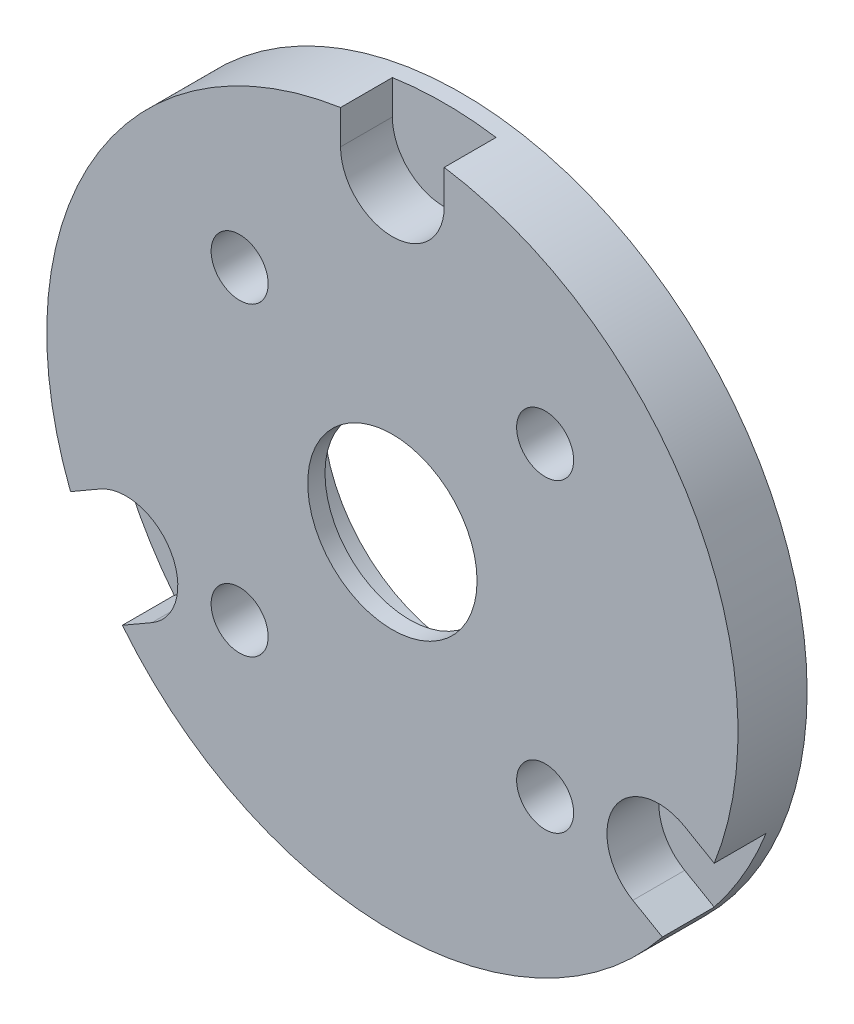
ISO-10303-21;
HEADER;
FILE_DESCRIPTION(('STEP AP214'),'2;1');
FILE_NAME('part.step','',(''),(''),'','','');
FILE_SCHEMA(('AUTOMOTIVE_DESIGN { 1 0 10303 214 1 1 1 1 }'));
ENDSEC;
DATA;
#1=APPLICATION_CONTEXT('core data for automotive mechanical design processes');
#2=APPLICATION_PROTOCOL_DEFINITION('international standard','automotive_design',2000,#1);
#3=PRODUCT_CONTEXT('',#1,'mechanical');
#4=PRODUCT('Part','Part','',(#3));
#5=PRODUCT_RELATED_PRODUCT_CATEGORY('part','',(#4));
#6=PRODUCT_DEFINITION_FORMATION('','',#4);
#7=PRODUCT_DEFINITION_CONTEXT('part definition',#1,'design');
#8=PRODUCT_DEFINITION('design','',#6,#7);
#9=PRODUCT_DEFINITION_SHAPE('','',#8);
#10=(LENGTH_UNIT() NAMED_UNIT(*) SI_UNIT(.MILLI.,.METRE.));
#11=(NAMED_UNIT(*) PLANE_ANGLE_UNIT() SI_UNIT($,.RADIAN.));
#12=(NAMED_UNIT(*) SI_UNIT($,.STERADIAN.) SOLID_ANGLE_UNIT());
#13=UNCERTAINTY_MEASURE_WITH_UNIT(LENGTH_MEASURE(1.E-05),#10,'distance_accuracy_value','');
#14=(GEOMETRIC_REPRESENTATION_CONTEXT(3) GLOBAL_UNCERTAINTY_ASSIGNED_CONTEXT((#13)) GLOBAL_UNIT_ASSIGNED_CONTEXT((#10,
#11,#12)) REPRESENTATION_CONTEXT('',''));
#15=CARTESIAN_POINT('',(0.,0.,0.));
#16=DIRECTION('',(0.,0.,1.));
#17=DIRECTION('',(1.,0.,0.));
#18=AXIS2_PLACEMENT_3D('',#15,#16,#17);
#19=CARTESIAN_POINT('',(0.,0.,0.));
#20=DIRECTION('',(0.,0.,1.));
#21=DIRECTION('',(1.,0.,0.));
#22=AXIS2_PLACEMENT_3D('',#19,#20,#21);
#23=CYLINDRICAL_SURFACE('',#22,4.9);
#24=CARTESIAN_POINT('',(0.,0.,4.));
#25=DIRECTION('',(0.,0.,1.));
#26=DIRECTION('',(1.,0.,0.));
#27=AXIS2_PLACEMENT_3D('',#24,#25,#26);
#28=CIRCLE('',#27,4.9);
#29=CARTESIAN_POINT('',(4.9,0.,4.));
#30=VERTEX_POINT('',#29);
#31=EDGE_CURVE('E453',#30,#30,#28,.T.);
#32=ORIENTED_EDGE('',*,*,#31,.T.);
#33=EDGE_LOOP('',(#32));
#34=FACE_BOUND('',#33,.T.);
#35=CARTESIAN_POINT('',(0.,0.,3.));
#36=DIRECTION('',(0.,0.,-1.));
#37=DIRECTION('',(-1.,0.,0.));
#38=AXIS2_PLACEMENT_3D('',#35,#36,#37);
#39=CIRCLE('',#38,4.9);
#40=CARTESIAN_POINT('',(-4.9,0.,3.));
#41=VERTEX_POINT('',#40);
#42=EDGE_CURVE('E38',#41,#41,#39,.F.);
#43=ORIENTED_EDGE('',*,*,#42,.F.);
#44=EDGE_LOOP('',(#43));
#45=FACE_BOUND('',#44,.T.);
#46=ADVANCED_FACE('F34',(#34,#45),#23,.F.);
#47=CARTESIAN_POINT('',(0.,0.,4.));
#48=DIRECTION('',(0.,0.,-1.));
#49=DIRECTION('',(-1.,0.,0.));
#50=AXIS2_PLACEMENT_3D('',#47,#48,#49);
#51=CYLINDRICAL_SURFACE('',#50,20.);
#52=CARTESIAN_POINT('',(0.,0.,4.));
#53=DIRECTION('',(0.,0.,1.));
#54=DIRECTION('',(1.,0.,0.));
#55=AXIS2_PLACEMENT_3D('',#52,#53,#54);
#56=CIRCLE('',#55,20.);
#57=CARTESIAN_POINT('',(-15.6245437895434,-12.4849361779962,4.));
#58=VERTEX_POINT('',#57);
#59=CARTESIAN_POINT('',(15.624543789544,-12.4849361779956,4.));
#60=VERTEX_POINT('',#59);
#61=EDGE_CURVE('E210',#58,#60,#56,.T.);
#62=ORIENTED_EDGE('',*,*,#61,.F.);
#63=DIRECTION('',(0.,0.,-1.));
#64=VECTOR('',#63,1.);
#65=CARTESIAN_POINT('',(-15.6245437895434,-12.4849361779962,4.));
#66=LINE('',#65,#64);
#67=CARTESIAN_POINT('',(-15.6245437895434,-12.4849361779962,1.));
#68=VERTEX_POINT('',#67);
#69=EDGE_CURVE('E155',#58,#68,#66,.T.);
#70=ORIENTED_EDGE('',*,*,#69,.T.);
#71=CARTESIAN_POINT('',(0.,0.,1.));
#72=DIRECTION('',(0.,0.,1.));
#73=DIRECTION('',(1.,0.,0.));
#74=AXIS2_PLACEMENT_3D('',#71,#72,#73);
#75=CIRCLE('',#74,20.);
#76=CARTESIAN_POINT('',(-18.6245437895436,-7.28878375528967,1.));
#77=VERTEX_POINT('',#76);
#78=EDGE_CURVE('E11',#77,#68,#75,.T.);
#79=ORIENTED_EDGE('',*,*,#78,.F.);
#80=DIRECTION('',(0.,0.,-1.));
#81=VECTOR('',#80,1.);
#82=CARTESIAN_POINT('',(-18.6245437895436,-7.28878375528967,4.));
#83=LINE('',#82,#81);
#84=CARTESIAN_POINT('',(-18.6245437895436,-7.28878375528967,4.));
#85=VERTEX_POINT('',#84);
#86=EDGE_CURVE('E137',#77,#85,#83,.F.);
#87=ORIENTED_EDGE('',*,*,#86,.T.);
#88=CARTESIAN_POINT('',(-3.,19.7737199332852,4.));
#89=VERTEX_POINT('',#88);
#90=EDGE_CURVE('E206',#89,#85,#56,.T.);
#91=ORIENTED_EDGE('',*,*,#90,.F.);
#92=DIRECTION('',(0.,0.,-1.));
#93=VECTOR('',#92,1.);
#94=CARTESIAN_POINT('',(-3.,19.7737199332852,4.));
#95=LINE('',#94,#93);
#96=CARTESIAN_POINT('',(-3.,19.7737199332852,1.));
#97=VERTEX_POINT('',#96);
#98=EDGE_CURVE('E202',#89,#97,#95,.T.);
#99=ORIENTED_EDGE('',*,*,#98,.T.);
#100=CARTESIAN_POINT('',(0.,0.,1.));
#101=DIRECTION('',(0.,0.,1.));
#102=DIRECTION('',(1.,0.,0.));
#103=AXIS2_PLACEMENT_3D('',#100,#101,#102);
#104=CIRCLE('',#103,20.);
#105=CARTESIAN_POINT('',(3.,19.7737199332852,1.));
#106=VERTEX_POINT('',#105);
#107=EDGE_CURVE('E215',#106,#97,#104,.T.);
#108=ORIENTED_EDGE('',*,*,#107,.F.);
#109=DIRECTION('',(0.,0.,-1.));
#110=VECTOR('',#109,1.);
#111=CARTESIAN_POINT('',(3.,19.7737199332852,4.));
#112=LINE('',#111,#110);
#113=CARTESIAN_POINT('',(3.,19.7737199332852,4.));
#114=VERTEX_POINT('',#113);
#115=EDGE_CURVE('E197',#106,#114,#112,.F.);
#116=ORIENTED_EDGE('',*,*,#115,.T.);
#117=CARTESIAN_POINT('',(18.6245437895439,-7.28878375528888,4.));
#118=VERTEX_POINT('',#117);
#119=EDGE_CURVE('E211',#118,#114,#56,.T.);
#120=ORIENTED_EDGE('',*,*,#119,.F.);
#121=DIRECTION('',(0.,0.,-1.));
#122=VECTOR('',#121,1.);
#123=CARTESIAN_POINT('',(18.6245437895439,-7.28878375528888,4.));
#124=LINE('',#123,#122);
#125=CARTESIAN_POINT('',(18.6245437895439,-7.28878375528888,1.));
#126=VERTEX_POINT('',#125);
#127=EDGE_CURVE('E177',#118,#126,#124,.T.);
#128=ORIENTED_EDGE('',*,*,#127,.T.);
#129=CARTESIAN_POINT('',(0.,0.,1.));
#130=DIRECTION('',(0.,0.,1.));
#131=DIRECTION('',(1.,0.,0.));
#132=AXIS2_PLACEMENT_3D('',#129,#130,#131);
#133=CIRCLE('',#132,20.);
#134=CARTESIAN_POINT('',(15.624543789544,-12.4849361779956,1.));
#135=VERTEX_POINT('',#134);
#136=EDGE_CURVE('E219',#135,#126,#133,.T.);
#137=ORIENTED_EDGE('',*,*,#136,.F.);
#138=DIRECTION('',(0.,0.,-1.));
#139=VECTOR('',#138,1.);
#140=CARTESIAN_POINT('',(15.624543789544,-12.4849361779956,4.));
#141=LINE('',#140,#139);
#142=EDGE_CURVE('E173',#135,#60,#141,.F.);
#143=ORIENTED_EDGE('',*,*,#142,.T.);
#144=EDGE_LOOP('',(#62,#70,#79,#87,#91,#99,#108,#116,#120,#128,#137,#143));
#145=FACE_BOUND('',#144,.T.);
#146=CARTESIAN_POINT('',(0.,0.,0.));
#147=DIRECTION('',(0.,0.,1.));
#148=DIRECTION('',(1.,0.,0.));
#149=AXIS2_PLACEMENT_3D('',#146,#147,#148);
#150=CIRCLE('',#149,20.);
#151=CARTESIAN_POINT('',(20.,0.,0.));
#152=VERTEX_POINT('',#151);
#153=EDGE_CURVE('E205',#152,#152,#150,.T.);
#154=ORIENTED_EDGE('',*,*,#153,.T.);
#155=EDGE_LOOP('',(#154));
#156=FACE_BOUND('',#155,.T.);
#157=ADVANCED_FACE('F36',(#145,#156),#51,.T.);
#158=CARTESIAN_POINT('',(0.,0.,4.));
#159=DIRECTION('',(0.,0.,1.));
#160=DIRECTION('',(1.,0.,0.));
#161=AXIS2_PLACEMENT_3D('',#158,#159,#160);
#162=PLANE('',#161);
#163=ORIENTED_EDGE('',*,*,#31,.F.);
#164=EDGE_LOOP('',(#163));
#165=FACE_BOUND('',#164,.T.);
#166=CARTESIAN_POINT('',(-8.83883476483186,8.83883476483183,4.));
#167=DIRECTION('',(0.,0.,1.));
#168=DIRECTION('',(1.,0.,0.));
#169=AXIS2_PLACEMENT_3D('',#166,#167,#168);
#170=CIRCLE('',#169,1.64999999999999);
#171=CARTESIAN_POINT('',(-7.18883476483187,8.83883476483183,4.));
#172=VERTEX_POINT('',#171);
#173=EDGE_CURVE('E455',#172,#172,#170,.T.);
#174=ORIENTED_EDGE('',*,*,#173,.F.);
#175=EDGE_LOOP('',(#174));
#176=FACE_BOUND('',#175,.T.);
#177=CARTESIAN_POINT('',(8.83883476483182,8.8388347648321,4.));
#178=DIRECTION('',(0.,0.,1.));
#179=DIRECTION('',(1.,0.,0.));
#180=AXIS2_PLACEMENT_3D('',#177,#178,#179);
#181=CIRCLE('',#180,1.64999999999999);
#182=CARTESIAN_POINT('',(10.4888347648318,8.8388347648321,4.));
#183=VERTEX_POINT('',#182);
#184=EDGE_CURVE('E461',#183,#183,#181,.T.);
#185=ORIENTED_EDGE('',*,*,#184,.F.);
#186=EDGE_LOOP('',(#185));
#187=FACE_BOUND('',#186,.T.);
#188=CARTESIAN_POINT('',(8.8388347648321,-8.83883476483158,4.));
#189=DIRECTION('',(0.,0.,1.));
#190=DIRECTION('',(1.,0.,0.));
#191=AXIS2_PLACEMENT_3D('',#188,#189,#190);
#192=CIRCLE('',#191,1.64999999999999);
#193=CARTESIAN_POINT('',(10.4888347648321,-8.83883476483158,4.));
#194=VERTEX_POINT('',#193);
#195=EDGE_CURVE('E467',#194,#194,#192,.T.);
#196=ORIENTED_EDGE('',*,*,#195,.F.);
#197=EDGE_LOOP('',(#196));
#198=FACE_BOUND('',#197,.T.);
#199=CARTESIAN_POINT('',(-8.83883476483158,-8.83883476483186,4.));
#200=DIRECTION('',(0.,0.,1.));
#201=DIRECTION('',(1.,0.,0.));
#202=AXIS2_PLACEMENT_3D('',#199,#200,#201);
#203=CIRCLE('',#202,1.64999999999999);
#204=CARTESIAN_POINT('',(-7.18883476483159,-8.83883476483186,4.));
#205=VERTEX_POINT('',#204);
#206=EDGE_CURVE('E472',#205,#205,#203,.T.);
#207=ORIENTED_EDGE('',*,*,#206,.F.);
#208=EDGE_LOOP('',(#207));
#209=FACE_BOUND('',#208,.T.);
#210=DIRECTION('',(0.866025403784439,0.5,0.));
#211=VECTOR('',#210,1.);
#212=CARTESIAN_POINT('',(1.50000000000021,-2.59807621135367,4.));
#213=LINE('',#212,#211);
#214=CARTESIAN_POINT('',(-13.9152521873626,-11.4980762113536,4.));
#215=VERTEX_POINT('',#214);
#216=EDGE_CURVE('E43',#58,#215,#213,.T.);
#217=ORIENTED_EDGE('',*,*,#216,.F.);
#218=ORIENTED_EDGE('',*,*,#61,.T.);
#219=DIRECTION('',(0.866025403784439,-0.5,0.));
#220=VECTOR('',#219,1.);
#221=CARTESIAN_POINT('',(20.1506350946114,-15.0980762113531,4.));
#222=LINE('',#221,#220);
#223=CARTESIAN_POINT('',(13.9152521873634,-11.4980762113531,4.));
#224=VERTEX_POINT('',#223);
#225=EDGE_CURVE('E162',#224,#60,#222,.T.);
#226=ORIENTED_EDGE('',*,*,#225,.F.);
#227=CARTESIAN_POINT('',(15.4152521873634,-8.89999999999976,4.));
#228=DIRECTION('',(0.,0.,1.));
#229=DIRECTION('',(1.,0.,0.));
#230=AXIS2_PLACEMENT_3D('',#227,#228,#229);
#231=CIRCLE('',#230,3.);
#232=CARTESIAN_POINT('',(16.9152521873634,-6.30192378864644,4.));
#233=VERTEX_POINT('',#232);
#234=EDGE_CURVE('E58',#233,#224,#231,.T.);
#235=ORIENTED_EDGE('',*,*,#234,.F.);
#236=DIRECTION('',(-0.866025403784439,0.5,0.));
#237=VECTOR('',#236,1.);
#238=CARTESIAN_POINT('',(1.50000000000021,2.59807621135368,4.));
#239=LINE('',#238,#237);
#240=EDGE_CURVE('E217',#118,#233,#239,.T.);
#241=ORIENTED_EDGE('',*,*,#240,.F.);
#242=ORIENTED_EDGE('',*,*,#119,.T.);
#243=DIRECTION('',(0.,1.,0.));
#244=VECTOR('',#243,1.);
#245=CARTESIAN_POINT('',(3.,25.,4.));
#246=LINE('',#245,#244);
#247=CARTESIAN_POINT('',(3.,17.8,4.));
#248=VERTEX_POINT('',#247);
#249=EDGE_CURVE('E185',#248,#114,#246,.T.);
#250=ORIENTED_EDGE('',*,*,#249,.F.);
#251=CARTESIAN_POINT('',(0.,17.8,4.));
#252=DIRECTION('',(0.,0.,1.));
#253=DIRECTION('',(1.,0.,0.));
#254=AXIS2_PLACEMENT_3D('',#251,#252,#253);
#255=CIRCLE('',#254,3.);
#256=CARTESIAN_POINT('',(-3.,17.8,4.));
#257=VERTEX_POINT('',#256);
#258=EDGE_CURVE('E180',#257,#248,#255,.T.);
#259=ORIENTED_EDGE('',*,*,#258,.F.);
#260=DIRECTION('',(0.,-1.,0.));
#261=VECTOR('',#260,1.);
#262=CARTESIAN_POINT('',(-3.,0.,4.));
#263=LINE('',#262,#261);
#264=EDGE_CURVE('E209',#89,#257,#263,.T.);
#265=ORIENTED_EDGE('',*,*,#264,.F.);
#266=ORIENTED_EDGE('',*,*,#90,.T.);
#267=DIRECTION('',(-0.866025403784439,-0.5,0.));
#268=VECTOR('',#267,1.);
#269=CARTESIAN_POINT('',(-23.1506350946106,-9.90192378864692,4.));
#270=LINE('',#269,#268);
#271=CARTESIAN_POINT('',(-16.9152521873626,-6.30192378864692,4.));
#272=VERTEX_POINT('',#271);
#273=EDGE_CURVE('E144',#272,#85,#270,.T.);
#274=ORIENTED_EDGE('',*,*,#273,.F.);
#275=CARTESIAN_POINT('',(-15.4152521873626,-8.90000000000024,4.));
#276=DIRECTION('',(0.,0.,1.));
#277=DIRECTION('',(1.,0.,0.));
#278=AXIS2_PLACEMENT_3D('',#275,#276,#277);
#279=CIRCLE('',#278,3.);
#280=EDGE_CURVE('E50',#215,#272,#279,.T.);
#281=ORIENTED_EDGE('',*,*,#280,.F.);
#282=EDGE_LOOP('',(#217,#218,#226,#235,#241,#242,#250,#259,#265,#266,#274,#281));
#283=FACE_BOUND('',#282,.T.);
#284=ADVANCED_FACE('F226',(#165,#176,#187,#198,#209,#283),#162,.T.);
#285=CARTESIAN_POINT('',(0.,0.,0.));
#286=DIRECTION('',(0.,0.,1.));
#287=DIRECTION('',(1.,0.,0.));
#288=AXIS2_PLACEMENT_3D('',#285,#286,#287);
#289=PLANE('',#288);
#290=CARTESIAN_POINT('',(0.,0.,0.));
#291=DIRECTION('',(0.,0.,-1.));
#292=DIRECTION('',(-1.,0.,0.));
#293=AXIS2_PLACEMENT_3D('',#290,#291,#292);
#294=CIRCLE('',#293,8.);
#295=CARTESIAN_POINT('',(-8.,0.,0.));
#296=VERTEX_POINT('',#295);
#297=EDGE_CURVE('E449',#296,#296,#294,.T.);
#298=ORIENTED_EDGE('',*,*,#297,.F.);
#299=EDGE_LOOP('',(#298));
#300=FACE_BOUND('',#299,.T.);
#301=CARTESIAN_POINT('',(-8.83883476483186,8.83883476483183,0.));
#302=DIRECTION('',(0.,0.,1.));
#303=DIRECTION('',(1.,0.,0.));
#304=AXIS2_PLACEMENT_3D('',#301,#302,#303);
#305=CIRCLE('',#304,1.65);
#306=CARTESIAN_POINT('',(-7.18883476483186,8.83883476483183,0.));
#307=VERTEX_POINT('',#306);
#308=EDGE_CURVE('E458',#307,#307,#305,.T.);
#309=ORIENTED_EDGE('',*,*,#308,.T.);
#310=EDGE_LOOP('',(#309));
#311=FACE_BOUND('',#310,.T.);
#312=CARTESIAN_POINT('',(8.83883476483182,8.8388347648321,0.));
#313=DIRECTION('',(0.,0.,1.));
#314=DIRECTION('',(1.,0.,0.));
#315=AXIS2_PLACEMENT_3D('',#312,#313,#314);
#316=CIRCLE('',#315,1.65);
#317=CARTESIAN_POINT('',(10.4888347648318,8.8388347648321,0.));
#318=VERTEX_POINT('',#317);
#319=EDGE_CURVE('E464',#318,#318,#316,.T.);
#320=ORIENTED_EDGE('',*,*,#319,.T.);
#321=EDGE_LOOP('',(#320));
#322=FACE_BOUND('',#321,.T.);
#323=CARTESIAN_POINT('',(8.8388347648321,-8.83883476483158,0.));
#324=DIRECTION('',(0.,0.,1.));
#325=DIRECTION('',(1.,0.,0.));
#326=AXIS2_PLACEMENT_3D('',#323,#324,#325);
#327=CIRCLE('',#326,1.65);
#328=CARTESIAN_POINT('',(10.4888347648321,-8.83883476483158,0.));
#329=VERTEX_POINT('',#328);
#330=EDGE_CURVE('E470',#329,#329,#327,.T.);
#331=ORIENTED_EDGE('',*,*,#330,.T.);
#332=EDGE_LOOP('',(#331));
#333=FACE_BOUND('',#332,.T.);
#334=CARTESIAN_POINT('',(-8.83883476483158,-8.83883476483186,0.));
#335=DIRECTION('',(0.,0.,1.));
#336=DIRECTION('',(1.,0.,0.));
#337=AXIS2_PLACEMENT_3D('',#334,#335,#336);
#338=CIRCLE('',#337,1.65);
#339=CARTESIAN_POINT('',(-7.18883476483158,-8.83883476483186,0.));
#340=VERTEX_POINT('',#339);
#341=EDGE_CURVE('E148',#340,#340,#338,.T.);
#342=ORIENTED_EDGE('',*,*,#341,.T.);
#343=EDGE_LOOP('',(#342));
#344=FACE_BOUND('',#343,.T.);
#345=ORIENTED_EDGE('',*,*,#153,.F.);
#346=EDGE_LOOP('',(#345));
#347=FACE_BOUND('',#346,.T.);
#348=ADVANCED_FACE('F311',(#300,#311,#322,#333,#344,#347),#289,.F.);
#349=CARTESIAN_POINT('',(0.,17.8,1.));
#350=DIRECTION('',(0.,0.,1.));
#351=DIRECTION('',(1.,0.,0.));
#352=AXIS2_PLACEMENT_3D('',#349,#350,#351);
#353=PLANE('',#352);
#354=ORIENTED_EDGE('',*,*,#107,.T.);
#355=DIRECTION('',(0.,-1.,0.));
#356=VECTOR('',#355,1.);
#357=CARTESIAN_POINT('',(-3.,17.8,1.));
#358=LINE('',#357,#356);
#359=CARTESIAN_POINT('',(-3.,17.8,1.));
#360=VERTEX_POINT('',#359);
#361=EDGE_CURVE('E188',#97,#360,#358,.T.);
#362=ORIENTED_EDGE('',*,*,#361,.T.);
#363=CARTESIAN_POINT('',(0.,17.8,1.));
#364=DIRECTION('',(0.,0.,1.));
#365=DIRECTION('',(1.,0.,0.));
#366=AXIS2_PLACEMENT_3D('',#363,#364,#365);
#367=CIRCLE('',#366,3.);
#368=CARTESIAN_POINT('',(3.,17.8,1.));
#369=VERTEX_POINT('',#368);
#370=EDGE_CURVE('E181',#360,#369,#367,.T.);
#371=ORIENTED_EDGE('',*,*,#370,.T.);
#372=DIRECTION('',(0.,1.,0.));
#373=VECTOR('',#372,1.);
#374=CARTESIAN_POINT('',(3.,25.,1.));
#375=LINE('',#374,#373);
#376=EDGE_CURVE('E184',#369,#106,#375,.T.);
#377=ORIENTED_EDGE('',*,*,#376,.T.);
#378=EDGE_LOOP('',(#354,#362,#371,#377));
#379=FACE_BOUND('',#378,.T.);
#380=ADVANCED_FACE('F243',(#379),#353,.T.);
#381=CARTESIAN_POINT('',(-3.,17.8,1.));
#382=DIRECTION('',(-1.,0.,0.));
#383=DIRECTION('',(0.,0.,1.));
#384=AXIS2_PLACEMENT_3D('',#381,#382,#383);
#385=PLANE('',#384);
#386=ORIENTED_EDGE('',*,*,#264,.T.);
#387=DIRECTION('',(0.,0.,1.));
#388=VECTOR('',#387,1.);
#389=CARTESIAN_POINT('',(-3.,17.8,1.));
#390=LINE('',#389,#388);
#391=EDGE_CURVE('E194',#360,#257,#390,.T.);
#392=ORIENTED_EDGE('',*,*,#391,.F.);
#393=ORIENTED_EDGE('',*,*,#361,.F.);
#394=ORIENTED_EDGE('',*,*,#98,.F.);
#395=EDGE_LOOP('',(#386,#392,#393,#394));
#396=FACE_BOUND('',#395,.T.);
#397=ADVANCED_FACE('F246',(#396),#385,.F.);
#398=CARTESIAN_POINT('',(3.,25.,1.));
#399=DIRECTION('',(1.,0.,0.));
#400=DIRECTION('',(0.,0.,-1.));
#401=AXIS2_PLACEMENT_3D('',#398,#399,#400);
#402=PLANE('',#401);
#403=ORIENTED_EDGE('',*,*,#376,.F.);
#404=DIRECTION('',(0.,0.,1.));
#405=VECTOR('',#404,1.);
#406=CARTESIAN_POINT('',(3.,17.8,1.));
#407=LINE('',#406,#405);
#408=EDGE_CURVE('E190',#369,#248,#407,.T.);
#409=ORIENTED_EDGE('',*,*,#408,.T.);
#410=ORIENTED_EDGE('',*,*,#249,.T.);
#411=ORIENTED_EDGE('',*,*,#115,.F.);
#412=EDGE_LOOP('',(#403,#409,#410,#411));
#413=FACE_BOUND('',#412,.T.);
#414=ADVANCED_FACE('F239',(#413),#402,.F.);
#415=CARTESIAN_POINT('',(0.,17.8,1.));
#416=DIRECTION('',(0.,0.,1.));
#417=DIRECTION('',(1.,0.,0.));
#418=AXIS2_PLACEMENT_3D('',#415,#416,#417);
#419=CYLINDRICAL_SURFACE('',#418,3.);
#420=ORIENTED_EDGE('',*,*,#258,.T.);
#421=ORIENTED_EDGE('',*,*,#408,.F.);
#422=ORIENTED_EDGE('',*,*,#370,.F.);
#423=ORIENTED_EDGE('',*,*,#391,.T.);
#424=EDGE_LOOP('',(#420,#421,#422,#423));
#425=FACE_BOUND('',#424,.T.);
#426=ADVANCED_FACE('F249',(#425),#419,.F.);
#427=CARTESIAN_POINT('',(15.4152521873634,-8.89999999999976,1.));
#428=DIRECTION('',(0.,0.,1.));
#429=DIRECTION('',(1.,0.,0.));
#430=AXIS2_PLACEMENT_3D('',#427,#428,#429);
#431=PLANE('',#430);
#432=ORIENTED_EDGE('',*,*,#136,.T.);
#433=DIRECTION('',(-0.866025403784439,0.5,0.));
#434=VECTOR('',#433,1.);
#435=CARTESIAN_POINT('',(16.9152521873634,-6.30192378864644,1.));
#436=LINE('',#435,#434);
#437=CARTESIAN_POINT('',(16.9152521873634,-6.30192378864644,1.));
#438=VERTEX_POINT('',#437);
#439=EDGE_CURVE('E165',#126,#438,#436,.T.);
#440=ORIENTED_EDGE('',*,*,#439,.T.);
#441=CARTESIAN_POINT('',(15.4152521873634,-8.89999999999976,1.));
#442=DIRECTION('',(0.,0.,1.));
#443=DIRECTION('',(1.,0.,0.));
#444=AXIS2_PLACEMENT_3D('',#441,#442,#443);
#445=CIRCLE('',#444,3.);
#446=CARTESIAN_POINT('',(13.9152521873634,-11.4980762113531,1.));
#447=VERTEX_POINT('',#446);
#448=EDGE_CURVE('E158',#438,#447,#445,.T.);
#449=ORIENTED_EDGE('',*,*,#448,.T.);
#450=DIRECTION('',(0.866025403784439,-0.5,0.));
#451=VECTOR('',#450,1.);
#452=CARTESIAN_POINT('',(20.1506350946114,-15.0980762113531,1.));
#453=LINE('',#452,#451);
#454=EDGE_CURVE('E161',#447,#135,#453,.T.);
#455=ORIENTED_EDGE('',*,*,#454,.T.);
#456=EDGE_LOOP('',(#432,#440,#449,#455));
#457=FACE_BOUND('',#456,.T.);
#458=ADVANCED_FACE('F251',(#457),#431,.T.);
#459=CARTESIAN_POINT('',(16.9152521873634,-6.30192378864644,1.));
#460=DIRECTION('',(0.5,0.866025403784439,0.));
#461=DIRECTION('',(-0.866025403784439,0.5,0.));
#462=AXIS2_PLACEMENT_3D('',#459,#460,#461);
#463=PLANE('',#462);
#464=ORIENTED_EDGE('',*,*,#240,.T.);
#465=DIRECTION('',(0.,0.,1.));
#466=VECTOR('',#465,1.);
#467=CARTESIAN_POINT('',(16.9152521873634,-6.30192378864644,1.));
#468=LINE('',#467,#466);
#469=EDGE_CURVE('E171',#438,#233,#468,.T.);
#470=ORIENTED_EDGE('',*,*,#469,.F.);
#471=ORIENTED_EDGE('',*,*,#439,.F.);
#472=ORIENTED_EDGE('',*,*,#127,.F.);
#473=EDGE_LOOP('',(#464,#470,#471,#472));
#474=FACE_BOUND('',#473,.T.);
#475=ADVANCED_FACE('F257',(#474),#463,.F.);
#476=CARTESIAN_POINT('',(20.1506350946114,-15.0980762113531,1.));
#477=DIRECTION('',(-0.5,-0.866025403784439,0.));
#478=DIRECTION('',(0.866025403784439,-0.5,0.));
#479=AXIS2_PLACEMENT_3D('',#476,#477,#478);
#480=PLANE('',#479);
#481=ORIENTED_EDGE('',*,*,#454,.F.);
#482=DIRECTION('',(0.,0.,1.));
#483=VECTOR('',#482,1.);
#484=CARTESIAN_POINT('',(13.9152521873634,-11.4980762113531,1.));
#485=LINE('',#484,#483);
#486=EDGE_CURVE('E167',#447,#224,#485,.T.);
#487=ORIENTED_EDGE('',*,*,#486,.T.);
#488=ORIENTED_EDGE('',*,*,#225,.T.);
#489=ORIENTED_EDGE('',*,*,#142,.F.);
#490=EDGE_LOOP('',(#481,#487,#488,#489));
#491=FACE_BOUND('',#490,.T.);
#492=ADVANCED_FACE('F302',(#491),#480,.F.);
#493=CARTESIAN_POINT('',(15.4152521873634,-8.89999999999976,1.));
#494=DIRECTION('',(0.,0.,1.));
#495=DIRECTION('',(1.,0.,0.));
#496=AXIS2_PLACEMENT_3D('',#493,#494,#495);
#497=CYLINDRICAL_SURFACE('',#496,3.);
#498=ORIENTED_EDGE('',*,*,#234,.T.);
#499=ORIENTED_EDGE('',*,*,#486,.F.);
#500=ORIENTED_EDGE('',*,*,#448,.F.);
#501=ORIENTED_EDGE('',*,*,#469,.T.);
#502=EDGE_LOOP('',(#498,#499,#500,#501));
#503=FACE_BOUND('',#502,.T.);
#504=ADVANCED_FACE('F293',(#503),#497,.F.);
#505=CARTESIAN_POINT('',(-15.4152521873626,-8.90000000000024,1.));
#506=DIRECTION('',(0.,0.,1.));
#507=DIRECTION('',(1.,0.,0.));
#508=AXIS2_PLACEMENT_3D('',#505,#506,#507);
#509=PLANE('',#508);
#510=ORIENTED_EDGE('',*,*,#78,.T.);
#511=DIRECTION('',(0.866025403784439,0.5,0.));
#512=VECTOR('',#511,1.);
#513=CARTESIAN_POINT('',(-13.9152521873626,-11.4980762113536,1.));
#514=LINE('',#513,#512);
#515=CARTESIAN_POINT('',(-13.9152521873626,-11.4980762113536,1.));
#516=VERTEX_POINT('',#515);
#517=EDGE_CURVE('E131',#68,#516,#514,.T.);
#518=ORIENTED_EDGE('',*,*,#517,.T.);
#519=CARTESIAN_POINT('',(-15.4152521873626,-8.90000000000024,1.));
#520=DIRECTION('',(0.,0.,1.));
#521=DIRECTION('',(1.,0.,0.));
#522=AXIS2_PLACEMENT_3D('',#519,#520,#521);
#523=CIRCLE('',#522,3.);
#524=CARTESIAN_POINT('',(-16.9152521873626,-6.30192378864692,1.));
#525=VERTEX_POINT('',#524);
#526=EDGE_CURVE('E127',#516,#525,#523,.T.);
#527=ORIENTED_EDGE('',*,*,#526,.T.);
#528=DIRECTION('',(-0.866025403784439,-0.5,0.));
#529=VECTOR('',#528,1.);
#530=CARTESIAN_POINT('',(-23.1506350946106,-9.90192378864692,1.));
#531=LINE('',#530,#529);
#532=EDGE_CURVE('E134',#525,#77,#531,.T.);
#533=ORIENTED_EDGE('',*,*,#532,.T.);
#534=EDGE_LOOP('',(#510,#518,#527,#533));
#535=FACE_BOUND('',#534,.T.);
#536=ADVANCED_FACE('F141',(#535),#509,.T.);
#537=CARTESIAN_POINT('',(-13.9152521873626,-11.4980762113536,1.));
#538=DIRECTION('',(0.5,-0.866025403784438,0.));
#539=DIRECTION('',(0.866025403784439,0.5,0.));
#540=AXIS2_PLACEMENT_3D('',#537,#538,#539);
#541=PLANE('',#540);
#542=ORIENTED_EDGE('',*,*,#216,.T.);
#543=DIRECTION('',(0.,0.,1.));
#544=VECTOR('',#543,1.);
#545=CARTESIAN_POINT('',(-13.9152521873626,-11.4980762113536,1.));
#546=LINE('',#545,#544);
#547=EDGE_CURVE('E130',#516,#215,#546,.T.);
#548=ORIENTED_EDGE('',*,*,#547,.F.);
#549=ORIENTED_EDGE('',*,*,#517,.F.);
#550=ORIENTED_EDGE('',*,*,#69,.F.);
#551=EDGE_LOOP('',(#542,#548,#549,#550));
#552=FACE_BOUND('',#551,.T.);
#553=ADVANCED_FACE('F223',(#552),#541,.F.);
#554=CARTESIAN_POINT('',(-23.1506350946106,-9.90192378864692,1.));
#555=DIRECTION('',(-0.5,0.866025403784439,0.));
#556=DIRECTION('',(-0.866025403784439,-0.5,0.));
#557=AXIS2_PLACEMENT_3D('',#554,#555,#556);
#558=PLANE('',#557);
#559=ORIENTED_EDGE('',*,*,#532,.F.);
#560=DIRECTION('',(0.,0.,1.));
#561=VECTOR('',#560,1.);
#562=CARTESIAN_POINT('',(-16.9152521873626,-6.30192378864692,1.));
#563=LINE('',#562,#561);
#564=EDGE_CURVE('E123',#525,#272,#563,.T.);
#565=ORIENTED_EDGE('',*,*,#564,.T.);
#566=ORIENTED_EDGE('',*,*,#273,.T.);
#567=ORIENTED_EDGE('',*,*,#86,.F.);
#568=EDGE_LOOP('',(#559,#565,#566,#567));
#569=FACE_BOUND('',#568,.T.);
#570=ADVANCED_FACE('F135',(#569),#558,.F.);
#571=CARTESIAN_POINT('',(-15.4152521873626,-8.90000000000024,1.));
#572=DIRECTION('',(0.,0.,1.));
#573=DIRECTION('',(1.,0.,0.));
#574=AXIS2_PLACEMENT_3D('',#571,#572,#573);
#575=CYLINDRICAL_SURFACE('',#574,3.);
#576=ORIENTED_EDGE('',*,*,#280,.T.);
#577=ORIENTED_EDGE('',*,*,#564,.F.);
#578=ORIENTED_EDGE('',*,*,#526,.F.);
#579=ORIENTED_EDGE('',*,*,#547,.T.);
#580=EDGE_LOOP('',(#576,#577,#578,#579));
#581=FACE_BOUND('',#580,.T.);
#582=ADVANCED_FACE('F125',(#581),#575,.F.);
#583=CARTESIAN_POINT('',(-8.83883476483158,-8.83883476483186,4.));
#584=DIRECTION('',(0.,0.,1.));
#585=DIRECTION('',(1.,0.,0.));
#586=AXIS2_PLACEMENT_3D('',#583,#584,#585);
#587=CYLINDRICAL_SURFACE('',#586,1.64999999999999);
#588=ORIENTED_EDGE('',*,*,#341,.F.);
#589=EDGE_LOOP('',(#588));
#590=FACE_BOUND('',#589,.T.);
#591=ORIENTED_EDGE('',*,*,#206,.T.);
#592=EDGE_LOOP('',(#591));
#593=FACE_BOUND('',#592,.T.);
#594=ADVANCED_FACE('F286',(#590,#593),#587,.F.);
#595=CARTESIAN_POINT('',(8.8388347648321,-8.83883476483158,4.));
#596=DIRECTION('',(0.,0.,1.));
#597=DIRECTION('',(1.,0.,0.));
#598=AXIS2_PLACEMENT_3D('',#595,#596,#597);
#599=CYLINDRICAL_SURFACE('',#598,1.64999999999999);
#600=ORIENTED_EDGE('',*,*,#330,.F.);
#601=EDGE_LOOP('',(#600));
#602=FACE_BOUND('',#601,.T.);
#603=ORIENTED_EDGE('',*,*,#195,.T.);
#604=EDGE_LOOP('',(#603));
#605=FACE_BOUND('',#604,.T.);
#606=ADVANCED_FACE('F282',(#602,#605),#599,.F.);
#607=CARTESIAN_POINT('',(8.83883476483182,8.8388347648321,4.));
#608=DIRECTION('',(0.,0.,1.));
#609=DIRECTION('',(1.,0.,0.));
#610=AXIS2_PLACEMENT_3D('',#607,#608,#609);
#611=CYLINDRICAL_SURFACE('',#610,1.64999999999999);
#612=ORIENTED_EDGE('',*,*,#319,.F.);
#613=EDGE_LOOP('',(#612));
#614=FACE_BOUND('',#613,.T.);
#615=ORIENTED_EDGE('',*,*,#184,.T.);
#616=EDGE_LOOP('',(#615));
#617=FACE_BOUND('',#616,.T.);
#618=ADVANCED_FACE('F278',(#614,#617),#611,.F.);
#619=CARTESIAN_POINT('',(-8.83883476483186,8.83883476483183,4.));
#620=DIRECTION('',(0.,0.,1.));
#621=DIRECTION('',(1.,0.,0.));
#622=AXIS2_PLACEMENT_3D('',#619,#620,#621);
#623=CYLINDRICAL_SURFACE('',#622,1.64999999999999);
#624=ORIENTED_EDGE('',*,*,#308,.F.);
#625=EDGE_LOOP('',(#624));
#626=FACE_BOUND('',#625,.T.);
#627=ORIENTED_EDGE('',*,*,#173,.T.);
#628=EDGE_LOOP('',(#627));
#629=FACE_BOUND('',#628,.T.);
#630=ADVANCED_FACE('F274',(#626,#629),#623,.F.);
#631=CARTESIAN_POINT('',(0.,0.,3.));
#632=DIRECTION('',(0.,0.,-1.));
#633=DIRECTION('',(-1.,0.,0.));
#634=AXIS2_PLACEMENT_3D('',#631,#632,#633);
#635=PLANE('',#634);
#636=CARTESIAN_POINT('',(0.,0.,3.));
#637=DIRECTION('',(0.,0.,-1.));
#638=DIRECTION('',(-1.,0.,0.));
#639=AXIS2_PLACEMENT_3D('',#636,#637,#638);
#640=CIRCLE('',#639,8.);
#641=CARTESIAN_POINT('',(-8.,0.,3.));
#642=VERTEX_POINT('',#641);
#643=EDGE_CURVE('E446',#642,#642,#640,.T.);
#644=ORIENTED_EDGE('',*,*,#643,.T.);
#645=EDGE_LOOP('',(#644));
#646=FACE_BOUND('',#645,.T.);
#647=ORIENTED_EDGE('',*,*,#42,.T.);
#648=EDGE_LOOP('',(#647));
#649=FACE_BOUND('',#648,.T.);
#650=ADVANCED_FACE('F277',(#646,#649),#635,.T.);
#651=CARTESIAN_POINT('',(0.,0.,3.));
#652=DIRECTION('',(0.,0.,-1.));
#653=DIRECTION('',(-1.,0.,0.));
#654=AXIS2_PLACEMENT_3D('',#651,#652,#653);
#655=CYLINDRICAL_SURFACE('',#654,8.);
#656=ORIENTED_EDGE('',*,*,#643,.F.);
#657=EDGE_LOOP('',(#656));
#658=FACE_BOUND('',#657,.T.);
#659=ORIENTED_EDGE('',*,*,#297,.T.);
#660=EDGE_LOOP('',(#659));
#661=FACE_BOUND('',#660,.T.);
#662=ADVANCED_FACE('F272',(#658,#661),#655,.F.);
#663=CLOSED_SHELL('',(#46,#157,#284,#348,#380,#397,#414,#426,#458,#475,#492,#504,#536,#553,#570,
#582,#594,#606,#618,#630,#650,#662));
#664=MANIFOLD_SOLID_BREP('B2',#663);
#665=ADVANCED_BREP_SHAPE_REPRESENTATION('',(#18,#664),#14);
#666=SHAPE_DEFINITION_REPRESENTATION(#9,#665);
ENDSEC;
END-ISO-10303-21;
